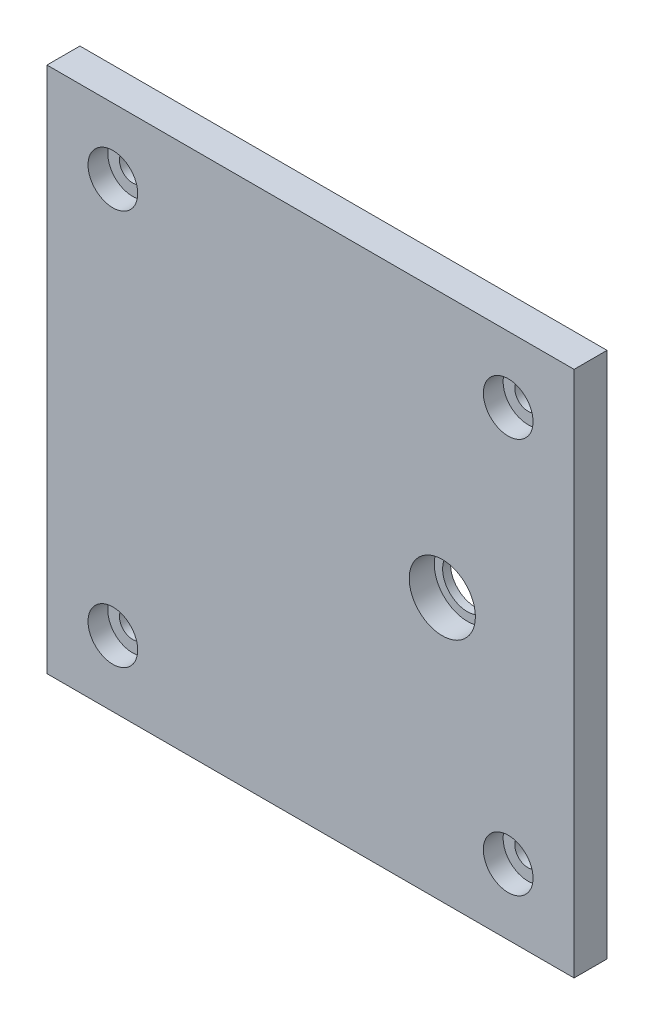
ISO-10303-21;
HEADER;
FILE_DESCRIPTION(('STEP AP214'),'2;1');
FILE_NAME('part.step','',(''),(''),'','','');
FILE_SCHEMA(('AUTOMOTIVE_DESIGN { 1 0 10303 214 1 1 1 1 }'));
ENDSEC;
DATA;
#1=APPLICATION_CONTEXT('core data for automotive mechanical design processes');
#2=APPLICATION_PROTOCOL_DEFINITION('international standard','automotive_design',2000,#1);
#3=PRODUCT_CONTEXT('',#1,'mechanical');
#4=PRODUCT('Part','Part','',(#3));
#5=PRODUCT_RELATED_PRODUCT_CATEGORY('part','',(#4));
#6=PRODUCT_DEFINITION_FORMATION('','',#4);
#7=PRODUCT_DEFINITION_CONTEXT('part definition',#1,'design');
#8=PRODUCT_DEFINITION('design','',#6,#7);
#9=PRODUCT_DEFINITION_SHAPE('','',#8);
#10=(LENGTH_UNIT() NAMED_UNIT(*) SI_UNIT(.MILLI.,.METRE.));
#11=(NAMED_UNIT(*) PLANE_ANGLE_UNIT() SI_UNIT($,.RADIAN.));
#12=(NAMED_UNIT(*) SI_UNIT($,.STERADIAN.) SOLID_ANGLE_UNIT());
#13=UNCERTAINTY_MEASURE_WITH_UNIT(LENGTH_MEASURE(1.E-05),#10,'distance_accuracy_value','');
#14=(GEOMETRIC_REPRESENTATION_CONTEXT(3) GLOBAL_UNCERTAINTY_ASSIGNED_CONTEXT((#13)) GLOBAL_UNIT_ASSIGNED_CONTEXT((#10,
#11,#12)) REPRESENTATION_CONTEXT('',''));
#15=CARTESIAN_POINT('',(0.,0.,0.));
#16=DIRECTION('',(0.,0.,1.));
#17=DIRECTION('',(1.,0.,0.));
#18=AXIS2_PLACEMENT_3D('',#15,#16,#17);
#19=CARTESIAN_POINT('',(-38.1,38.1,6.35));
#20=DIRECTION('',(0.,0.,1.));
#21=DIRECTION('',(1.,0.,0.));
#22=AXIS2_PLACEMENT_3D('',#19,#20,#21);
#23=CYLINDRICAL_SURFACE('',#22,4.7879);
#24=CARTESIAN_POINT('',(-38.1,38.1,2.54));
#25=DIRECTION('',(0.,0.,1.));
#26=DIRECTION('',(1.,0.,0.));
#27=AXIS2_PLACEMENT_3D('',#24,#25,#26);
#28=CIRCLE('',#27,4.7879);
#29=CARTESIAN_POINT('',(-33.3121,38.1,2.54));
#30=VERTEX_POINT('',#29);
#31=EDGE_CURVE('E122',#30,#30,#28,.T.);
#32=ORIENTED_EDGE('',*,*,#31,.F.);
#33=EDGE_LOOP('',(#32));
#34=FACE_BOUND('',#33,.T.);
#35=CARTESIAN_POINT('',(-38.1,38.1,6.35));
#36=DIRECTION('',(0.,0.,1.));
#37=DIRECTION('',(1.,0.,0.));
#38=AXIS2_PLACEMENT_3D('',#35,#36,#37);
#39=CIRCLE('',#38,4.7879);
#40=CARTESIAN_POINT('',(-33.3121,38.1,6.35));
#41=VERTEX_POINT('',#40);
#42=EDGE_CURVE('E131',#41,#41,#39,.F.);
#43=ORIENTED_EDGE('',*,*,#42,.F.);
#44=EDGE_LOOP('',(#43));
#45=FACE_BOUND('',#44,.T.);
#46=ADVANCED_FACE('F16',(#34,#45),#23,.F.);
#47=CARTESIAN_POINT('',(38.1,38.1,6.35));
#48=DIRECTION('',(0.,0.,1.));
#49=DIRECTION('',(1.,0.,0.));
#50=AXIS2_PLACEMENT_3D('',#47,#48,#49);
#51=CYLINDRICAL_SURFACE('',#50,4.7879);
#52=CARTESIAN_POINT('',(38.1,38.1,2.54));
#53=DIRECTION('',(0.,0.,1.));
#54=DIRECTION('',(1.,0.,0.));
#55=AXIS2_PLACEMENT_3D('',#52,#53,#54);
#56=CIRCLE('',#55,4.7879);
#57=CARTESIAN_POINT('',(42.8879,38.1,2.54));
#58=VERTEX_POINT('',#57);
#59=EDGE_CURVE('E119',#58,#58,#56,.T.);
#60=ORIENTED_EDGE('',*,*,#59,.F.);
#61=EDGE_LOOP('',(#60));
#62=FACE_BOUND('',#61,.T.);
#63=CARTESIAN_POINT('',(38.1,38.1,6.35));
#64=DIRECTION('',(0.,0.,1.));
#65=DIRECTION('',(1.,0.,0.));
#66=AXIS2_PLACEMENT_3D('',#63,#64,#65);
#67=CIRCLE('',#66,4.7879);
#68=CARTESIAN_POINT('',(42.8879,38.1,6.35));
#69=VERTEX_POINT('',#68);
#70=EDGE_CURVE('E128',#69,#69,#67,.F.);
#71=ORIENTED_EDGE('',*,*,#70,.F.);
#72=EDGE_LOOP('',(#71));
#73=FACE_BOUND('',#72,.T.);
#74=ADVANCED_FACE('F223',(#62,#73),#51,.F.);
#75=CARTESIAN_POINT('',(38.1,-38.1,6.35));
#76=DIRECTION('',(0.,0.,1.));
#77=DIRECTION('',(1.,0.,0.));
#78=AXIS2_PLACEMENT_3D('',#75,#76,#77);
#79=CYLINDRICAL_SURFACE('',#78,4.7879);
#80=CARTESIAN_POINT('',(38.1,-38.1,2.54));
#81=DIRECTION('',(0.,0.,1.));
#82=DIRECTION('',(1.,0.,0.));
#83=AXIS2_PLACEMENT_3D('',#80,#81,#82);
#84=CIRCLE('',#83,4.7879);
#85=CARTESIAN_POINT('',(42.8879,-38.1,2.54));
#86=VERTEX_POINT('',#85);
#87=EDGE_CURVE('E116',#86,#86,#84,.T.);
#88=ORIENTED_EDGE('',*,*,#87,.F.);
#89=EDGE_LOOP('',(#88));
#90=FACE_BOUND('',#89,.T.);
#91=CARTESIAN_POINT('',(38.1,-38.1,6.35));
#92=DIRECTION('',(0.,0.,1.));
#93=DIRECTION('',(1.,0.,0.));
#94=AXIS2_PLACEMENT_3D('',#91,#92,#93);
#95=CIRCLE('',#94,4.7879);
#96=CARTESIAN_POINT('',(42.8879,-38.1,6.35));
#97=VERTEX_POINT('',#96);
#98=EDGE_CURVE('E125',#97,#97,#95,.F.);
#99=ORIENTED_EDGE('',*,*,#98,.F.);
#100=EDGE_LOOP('',(#99));
#101=FACE_BOUND('',#100,.T.);
#102=ADVANCED_FACE('F154',(#90,#101),#79,.F.);
#103=CARTESIAN_POINT('',(-38.1,-38.1,6.35));
#104=DIRECTION('',(0.,0.,1.));
#105=DIRECTION('',(1.,0.,0.));
#106=AXIS2_PLACEMENT_3D('',#103,#104,#105);
#107=CYLINDRICAL_SURFACE('',#106,4.7879);
#108=CARTESIAN_POINT('',(-38.1,-38.1,2.54));
#109=DIRECTION('',(0.,0.,1.));
#110=DIRECTION('',(1.,0.,0.));
#111=AXIS2_PLACEMENT_3D('',#108,#109,#110);
#112=CIRCLE('',#111,4.7879);
#113=CARTESIAN_POINT('',(-33.3121,-38.1,2.54));
#114=VERTEX_POINT('',#113);
#115=EDGE_CURVE('E113',#114,#114,#112,.T.);
#116=ORIENTED_EDGE('',*,*,#115,.F.);
#117=EDGE_LOOP('',(#116));
#118=FACE_BOUND('',#117,.T.);
#119=CARTESIAN_POINT('',(-38.1,-38.1,6.35));
#120=DIRECTION('',(0.,0.,1.));
#121=DIRECTION('',(1.,0.,0.));
#122=AXIS2_PLACEMENT_3D('',#119,#120,#121);
#123=CIRCLE('',#122,4.7879);
#124=CARTESIAN_POINT('',(-33.3121,-38.1,6.35));
#125=VERTEX_POINT('',#124);
#126=EDGE_CURVE('E133',#125,#125,#123,.F.);
#127=ORIENTED_EDGE('',*,*,#126,.F.);
#128=EDGE_LOOP('',(#127));
#129=FACE_BOUND('',#128,.T.);
#130=ADVANCED_FACE('F143',(#118,#129),#107,.F.);
#131=CARTESIAN_POINT('',(25.4,0.,6.35));
#132=DIRECTION('',(0.,0.,1.));
#133=DIRECTION('',(1.,0.,0.));
#134=AXIS2_PLACEMENT_3D('',#131,#132,#133);
#135=CYLINDRICAL_SURFACE('',#134,6.3754);
#136=CARTESIAN_POINT('',(25.4,0.,1.524));
#137=DIRECTION('',(0.,0.,1.));
#138=DIRECTION('',(1.,0.,0.));
#139=AXIS2_PLACEMENT_3D('',#136,#137,#138);
#140=CIRCLE('',#139,6.3754);
#141=CARTESIAN_POINT('',(31.7754,0.,1.524));
#142=VERTEX_POINT('',#141);
#143=EDGE_CURVE('E75',#142,#142,#140,.T.);
#144=ORIENTED_EDGE('',*,*,#143,.F.);
#145=EDGE_LOOP('',(#144));
#146=FACE_BOUND('',#145,.T.);
#147=CARTESIAN_POINT('',(25.4,0.,6.35));
#148=DIRECTION('',(0.,0.,1.));
#149=DIRECTION('',(1.,0.,0.));
#150=AXIS2_PLACEMENT_3D('',#147,#148,#149);
#151=CIRCLE('',#150,6.3754);
#152=CARTESIAN_POINT('',(31.7754,0.,6.35));
#153=VERTEX_POINT('',#152);
#154=EDGE_CURVE('E19',#153,#153,#151,.F.);
#155=ORIENTED_EDGE('',*,*,#154,.F.);
#156=EDGE_LOOP('',(#155));
#157=FACE_BOUND('',#156,.T.);
#158=ADVANCED_FACE('F141',(#146,#157),#135,.F.);
#159=CARTESIAN_POINT('',(0.,0.,6.35));
#160=DIRECTION('',(0.,0.,1.));
#161=DIRECTION('',(1.,0.,0.));
#162=AXIS2_PLACEMENT_3D('',#159,#160,#161);
#163=PLANE('',#162);
#164=ORIENTED_EDGE('',*,*,#98,.T.);
#165=EDGE_LOOP('',(#164));
#166=FACE_BOUND('',#165,.T.);
#167=ORIENTED_EDGE('',*,*,#70,.T.);
#168=EDGE_LOOP('',(#167));
#169=FACE_BOUND('',#168,.T.);
#170=ORIENTED_EDGE('',*,*,#42,.T.);
#171=EDGE_LOOP('',(#170));
#172=FACE_BOUND('',#171,.T.);
#173=ORIENTED_EDGE('',*,*,#126,.T.);
#174=EDGE_LOOP('',(#173));
#175=FACE_BOUND('',#174,.T.);
#176=ORIENTED_EDGE('',*,*,#154,.T.);
#177=EDGE_LOOP('',(#176));
#178=FACE_BOUND('',#177,.T.);
#179=DIRECTION('',(1.,0.,0.));
#180=VECTOR('',#179,1.);
#181=CARTESIAN_POINT('',(50.8,50.8,6.35));
#182=LINE('',#181,#180);
#183=CARTESIAN_POINT('',(-50.8,50.8,6.35));
#184=VERTEX_POINT('',#183);
#185=CARTESIAN_POINT('',(50.8,50.8,6.35));
#186=VERTEX_POINT('',#185);
#187=EDGE_CURVE('E71',#184,#186,#182,.T.);
#188=ORIENTED_EDGE('',*,*,#187,.F.);
#189=DIRECTION('',(0.,1.,0.));
#190=VECTOR('',#189,1.);
#191=CARTESIAN_POINT('',(-50.8,50.8,6.35));
#192=LINE('',#191,#190);
#193=CARTESIAN_POINT('',(-50.8,-50.8,6.35));
#194=VERTEX_POINT('',#193);
#195=EDGE_CURVE('E67',#194,#184,#192,.T.);
#196=ORIENTED_EDGE('',*,*,#195,.F.);
#197=DIRECTION('',(1.,0.,0.));
#198=VECTOR('',#197,1.);
#199=CARTESIAN_POINT('',(-50.8,-50.8,6.35));
#200=LINE('',#199,#198);
#201=CARTESIAN_POINT('',(50.8,-50.8,6.35));
#202=VERTEX_POINT('',#201);
#203=EDGE_CURVE('E58',#202,#194,#200,.F.);
#204=ORIENTED_EDGE('',*,*,#203,.F.);
#205=DIRECTION('',(0.,1.,0.));
#206=VECTOR('',#205,1.);
#207=CARTESIAN_POINT('',(50.8,-50.8,6.35));
#208=LINE('',#207,#206);
#209=EDGE_CURVE('E53',#186,#202,#208,.F.);
#210=ORIENTED_EDGE('',*,*,#209,.F.);
#211=EDGE_LOOP('',(#188,#196,#204,#210));
#212=FACE_BOUND('',#211,.T.);
#213=ADVANCED_FACE('F70',(#166,#169,#172,#175,#178,#212),#163,.T.);
#214=CARTESIAN_POINT('',(0.,0.,2.54));
#215=DIRECTION('',(0.,0.,1.));
#216=DIRECTION('',(1.,0.,0.));
#217=AXIS2_PLACEMENT_3D('',#214,#215,#216);
#218=PLANE('',#217);
#219=CARTESIAN_POINT('',(-38.1,38.1,2.54));
#220=DIRECTION('',(0.,0.,1.));
#221=DIRECTION('',(1.,0.,0.));
#222=AXIS2_PLACEMENT_3D('',#219,#220,#221);
#223=CIRCLE('',#222,2.54);
#224=CARTESIAN_POINT('',(-35.56,38.1,2.54));
#225=VERTEX_POINT('',#224);
#226=EDGE_CURVE('E108',#225,#225,#223,.F.);
#227=ORIENTED_EDGE('',*,*,#226,.T.);
#228=EDGE_LOOP('',(#227));
#229=FACE_BOUND('',#228,.T.);
#230=ORIENTED_EDGE('',*,*,#31,.T.);
#231=EDGE_LOOP('',(#230));
#232=FACE_BOUND('',#231,.T.);
#233=ADVANCED_FACE('F151',(#229,#232),#218,.T.);
#234=CARTESIAN_POINT('',(0.,0.,2.54));
#235=DIRECTION('',(0.,0.,1.));
#236=DIRECTION('',(1.,0.,0.));
#237=AXIS2_PLACEMENT_3D('',#234,#235,#236);
#238=PLANE('',#237);
#239=CARTESIAN_POINT('',(38.1,38.1,2.54));
#240=DIRECTION('',(0.,0.,1.));
#241=DIRECTION('',(1.,0.,0.));
#242=AXIS2_PLACEMENT_3D('',#239,#240,#241);
#243=CIRCLE('',#242,2.54);
#244=CARTESIAN_POINT('',(40.64,38.1,2.54));
#245=VERTEX_POINT('',#244);
#246=EDGE_CURVE('E105',#245,#245,#243,.F.);
#247=ORIENTED_EDGE('',*,*,#246,.T.);
#248=EDGE_LOOP('',(#247));
#249=FACE_BOUND('',#248,.T.);
#250=ORIENTED_EDGE('',*,*,#59,.T.);
#251=EDGE_LOOP('',(#250));
#252=FACE_BOUND('',#251,.T.);
#253=ADVANCED_FACE('F208',(#249,#252),#238,.T.);
#254=CARTESIAN_POINT('',(0.,0.,2.54));
#255=DIRECTION('',(0.,0.,1.));
#256=DIRECTION('',(1.,0.,0.));
#257=AXIS2_PLACEMENT_3D('',#254,#255,#256);
#258=PLANE('',#257);
#259=CARTESIAN_POINT('',(38.1,-38.1,2.54));
#260=DIRECTION('',(0.,0.,1.));
#261=DIRECTION('',(1.,0.,0.));
#262=AXIS2_PLACEMENT_3D('',#259,#260,#261);
#263=CIRCLE('',#262,2.54);
#264=CARTESIAN_POINT('',(40.64,-38.1,2.54));
#265=VERTEX_POINT('',#264);
#266=EDGE_CURVE('E102',#265,#265,#263,.F.);
#267=ORIENTED_EDGE('',*,*,#266,.T.);
#268=EDGE_LOOP('',(#267));
#269=FACE_BOUND('',#268,.T.);
#270=ORIENTED_EDGE('',*,*,#87,.T.);
#271=EDGE_LOOP('',(#270));
#272=FACE_BOUND('',#271,.T.);
#273=ADVANCED_FACE('F204',(#269,#272),#258,.T.);
#274=CARTESIAN_POINT('',(0.,0.,2.54));
#275=DIRECTION('',(0.,0.,1.));
#276=DIRECTION('',(1.,0.,0.));
#277=AXIS2_PLACEMENT_3D('',#274,#275,#276);
#278=PLANE('',#277);
#279=CARTESIAN_POINT('',(-38.1,-38.1,2.54));
#280=DIRECTION('',(0.,0.,1.));
#281=DIRECTION('',(1.,0.,0.));
#282=AXIS2_PLACEMENT_3D('',#279,#280,#281);
#283=CIRCLE('',#282,2.54);
#284=CARTESIAN_POINT('',(-35.56,-38.1,2.54));
#285=VERTEX_POINT('',#284);
#286=EDGE_CURVE('E99',#285,#285,#283,.F.);
#287=ORIENTED_EDGE('',*,*,#286,.T.);
#288=EDGE_LOOP('',(#287));
#289=FACE_BOUND('',#288,.T.);
#290=ORIENTED_EDGE('',*,*,#115,.T.);
#291=EDGE_LOOP('',(#290));
#292=FACE_BOUND('',#291,.T.);
#293=ADVANCED_FACE('F200',(#289,#292),#278,.T.);
#294=CARTESIAN_POINT('',(0.,0.,1.524));
#295=DIRECTION('',(0.,0.,1.));
#296=DIRECTION('',(1.,0.,0.));
#297=AXIS2_PLACEMENT_3D('',#294,#295,#296);
#298=PLANE('',#297);
#299=CARTESIAN_POINT('',(25.4,0.,1.524));
#300=DIRECTION('',(0.,0.,1.));
#301=DIRECTION('',(1.,0.,0.));
#302=AXIS2_PLACEMENT_3D('',#299,#300,#301);
#303=CIRCLE('',#302,4.7625);
#304=CARTESIAN_POINT('',(30.1625,0.,1.524));
#305=VERTEX_POINT('',#304);
#306=EDGE_CURVE('E96',#305,#305,#303,.F.);
#307=ORIENTED_EDGE('',*,*,#306,.T.);
#308=EDGE_LOOP('',(#307));
#309=FACE_BOUND('',#308,.T.);
#310=ORIENTED_EDGE('',*,*,#143,.T.);
#311=EDGE_LOOP('',(#310));
#312=FACE_BOUND('',#311,.T.);
#313=ADVANCED_FACE('F197',(#309,#312),#298,.T.);
#314=CARTESIAN_POINT('',(-50.8,50.8,0.));
#315=DIRECTION('',(-1.,0.,0.));
#316=DIRECTION('',(0.,0.,1.));
#317=AXIS2_PLACEMENT_3D('',#314,#315,#316);
#318=PLANE('',#317);
#319=DIRECTION('',(0.,0.,1.));
#320=VECTOR('',#319,1.);
#321=CARTESIAN_POINT('',(-50.8,50.8,0.));
#322=LINE('',#321,#320);
#323=CARTESIAN_POINT('',(-50.8,50.8,0.));
#324=VERTEX_POINT('',#323);
#325=EDGE_CURVE('E383',#324,#184,#322,.T.);
#326=ORIENTED_EDGE('',*,*,#325,.F.);
#327=DIRECTION('',(0.,1.,0.));
#328=VECTOR('',#327,1.);
#329=CARTESIAN_POINT('',(-50.8,0.,0.));
#330=LINE('',#329,#328);
#331=CARTESIAN_POINT('',(-50.8,-50.8,0.));
#332=VERTEX_POINT('',#331);
#333=EDGE_CURVE('E79',#324,#332,#330,.F.);
#334=ORIENTED_EDGE('',*,*,#333,.T.);
#335=DIRECTION('',(0.,0.,-1.));
#336=VECTOR('',#335,1.);
#337=CARTESIAN_POINT('',(-50.8,-50.8,0.));
#338=LINE('',#337,#336);
#339=EDGE_CURVE('E63',#194,#332,#338,.T.);
#340=ORIENTED_EDGE('',*,*,#339,.F.);
#341=ORIENTED_EDGE('',*,*,#195,.T.);
#342=EDGE_LOOP('',(#326,#334,#340,#341));
#343=FACE_BOUND('',#342,.T.);
#344=ADVANCED_FACE('F78',(#343),#318,.T.);
#345=CARTESIAN_POINT('',(-50.8,-50.8,0.));
#346=DIRECTION('',(0.,-1.,0.));
#347=DIRECTION('',(0.,0.,-1.));
#348=AXIS2_PLACEMENT_3D('',#345,#346,#347);
#349=PLANE('',#348);
#350=ORIENTED_EDGE('',*,*,#339,.T.);
#351=DIRECTION('',(1.,0.,0.));
#352=VECTOR('',#351,1.);
#353=CARTESIAN_POINT('',(0.,-50.8,0.));
#354=LINE('',#353,#352);
#355=CARTESIAN_POINT('',(50.8,-50.8,0.));
#356=VERTEX_POINT('',#355);
#357=EDGE_CURVE('E385',#332,#356,#354,.T.);
#358=ORIENTED_EDGE('',*,*,#357,.T.);
#359=DIRECTION('',(0.,0.,-1.));
#360=VECTOR('',#359,1.);
#361=CARTESIAN_POINT('',(50.8,-50.8,0.));
#362=LINE('',#361,#360);
#363=EDGE_CURVE('E65',#202,#356,#362,.T.);
#364=ORIENTED_EDGE('',*,*,#363,.F.);
#365=ORIENTED_EDGE('',*,*,#203,.T.);
#366=EDGE_LOOP('',(#350,#358,#364,#365));
#367=FACE_BOUND('',#366,.T.);
#368=ADVANCED_FACE('F60',(#367),#349,.T.);
#369=CARTESIAN_POINT('',(50.8,-50.8,0.));
#370=DIRECTION('',(1.,0.,0.));
#371=DIRECTION('',(0.,0.,-1.));
#372=AXIS2_PLACEMENT_3D('',#369,#370,#371);
#373=PLANE('',#372);
#374=ORIENTED_EDGE('',*,*,#363,.T.);
#375=DIRECTION('',(0.,1.,0.));
#376=VECTOR('',#375,1.);
#377=CARTESIAN_POINT('',(50.8,0.,0.));
#378=LINE('',#377,#376);
#379=CARTESIAN_POINT('',(50.8,50.8,0.));
#380=VERTEX_POINT('',#379);
#381=EDGE_CURVE('E382',#356,#380,#378,.T.);
#382=ORIENTED_EDGE('',*,*,#381,.T.);
#383=DIRECTION('',(0.,0.,1.));
#384=VECTOR('',#383,1.);
#385=CARTESIAN_POINT('',(50.8,50.8,0.));
#386=LINE('',#385,#384);
#387=EDGE_CURVE('E34',#186,#380,#386,.F.);
#388=ORIENTED_EDGE('',*,*,#387,.F.);
#389=ORIENTED_EDGE('',*,*,#209,.T.);
#390=EDGE_LOOP('',(#374,#382,#388,#389));
#391=FACE_BOUND('',#390,.T.);
#392=ADVANCED_FACE('F190',(#391),#373,.T.);
#393=CARTESIAN_POINT('',(50.8,50.8,0.));
#394=DIRECTION('',(0.,1.,0.));
#395=DIRECTION('',(0.,0.,1.));
#396=AXIS2_PLACEMENT_3D('',#393,#394,#395);
#397=PLANE('',#396);
#398=ORIENTED_EDGE('',*,*,#387,.T.);
#399=DIRECTION('',(1.,0.,0.));
#400=VECTOR('',#399,1.);
#401=CARTESIAN_POINT('',(0.,50.8,0.));
#402=LINE('',#401,#400);
#403=EDGE_CURVE('E95',#380,#324,#402,.F.);
#404=ORIENTED_EDGE('',*,*,#403,.T.);
#405=ORIENTED_EDGE('',*,*,#325,.T.);
#406=ORIENTED_EDGE('',*,*,#187,.T.);
#407=EDGE_LOOP('',(#398,#404,#405,#406));
#408=FACE_BOUND('',#407,.T.);
#409=ADVANCED_FACE('F186',(#408),#397,.T.);
#410=CARTESIAN_POINT('',(-38.1,38.1,6.35));
#411=DIRECTION('',(0.,0.,1.));
#412=DIRECTION('',(1.,0.,0.));
#413=AXIS2_PLACEMENT_3D('',#410,#411,#412);
#414=CYLINDRICAL_SURFACE('',#413,2.54);
#415=CARTESIAN_POINT('',(-38.1,38.1,0.));
#416=DIRECTION('',(0.,0.,1.));
#417=DIRECTION('',(1.,0.,0.));
#418=AXIS2_PLACEMENT_3D('',#415,#416,#417);
#419=CIRCLE('',#418,2.54);
#420=CARTESIAN_POINT('',(-35.56,38.1,0.));
#421=VERTEX_POINT('',#420);
#422=EDGE_CURVE('E92',#421,#421,#419,.F.);
#423=ORIENTED_EDGE('',*,*,#422,.T.);
#424=EDGE_LOOP('',(#423));
#425=FACE_BOUND('',#424,.T.);
#426=ORIENTED_EDGE('',*,*,#226,.F.);
#427=EDGE_LOOP('',(#426));
#428=FACE_BOUND('',#427,.T.);
#429=ADVANCED_FACE('F182',(#425,#428),#414,.F.);
#430=CARTESIAN_POINT('',(38.1,38.1,6.35));
#431=DIRECTION('',(0.,0.,1.));
#432=DIRECTION('',(1.,0.,0.));
#433=AXIS2_PLACEMENT_3D('',#430,#431,#432);
#434=CYLINDRICAL_SURFACE('',#433,2.54);
#435=CARTESIAN_POINT('',(38.1,38.1,0.));
#436=DIRECTION('',(0.,0.,1.));
#437=DIRECTION('',(1.,0.,0.));
#438=AXIS2_PLACEMENT_3D('',#435,#436,#437);
#439=CIRCLE('',#438,2.54);
#440=CARTESIAN_POINT('',(40.64,38.1,0.));
#441=VERTEX_POINT('',#440);
#442=EDGE_CURVE('E89',#441,#441,#439,.F.);
#443=ORIENTED_EDGE('',*,*,#442,.T.);
#444=EDGE_LOOP('',(#443));
#445=FACE_BOUND('',#444,.T.);
#446=ORIENTED_EDGE('',*,*,#246,.F.);
#447=EDGE_LOOP('',(#446));
#448=FACE_BOUND('',#447,.T.);
#449=ADVANCED_FACE('F178',(#445,#448),#434,.F.);
#450=CARTESIAN_POINT('',(38.1,-38.1,6.35));
#451=DIRECTION('',(0.,0.,1.));
#452=DIRECTION('',(1.,0.,0.));
#453=AXIS2_PLACEMENT_3D('',#450,#451,#452);
#454=CYLINDRICAL_SURFACE('',#453,2.54);
#455=CARTESIAN_POINT('',(38.1,-38.1,0.));
#456=DIRECTION('',(0.,0.,1.));
#457=DIRECTION('',(1.,0.,0.));
#458=AXIS2_PLACEMENT_3D('',#455,#456,#457);
#459=CIRCLE('',#458,2.54);
#460=CARTESIAN_POINT('',(40.64,-38.1,0.));
#461=VERTEX_POINT('',#460);
#462=EDGE_CURVE('E86',#461,#461,#459,.F.);
#463=ORIENTED_EDGE('',*,*,#462,.T.);
#464=EDGE_LOOP('',(#463));
#465=FACE_BOUND('',#464,.T.);
#466=ORIENTED_EDGE('',*,*,#266,.F.);
#467=EDGE_LOOP('',(#466));
#468=FACE_BOUND('',#467,.T.);
#469=ADVANCED_FACE('F174',(#465,#468),#454,.F.);
#470=CARTESIAN_POINT('',(-38.1,-38.1,6.35));
#471=DIRECTION('',(0.,0.,1.));
#472=DIRECTION('',(1.,0.,0.));
#473=AXIS2_PLACEMENT_3D('',#470,#471,#472);
#474=CYLINDRICAL_SURFACE('',#473,2.54);
#475=CARTESIAN_POINT('',(-38.1,-38.1,0.));
#476=DIRECTION('',(0.,0.,1.));
#477=DIRECTION('',(1.,0.,0.));
#478=AXIS2_PLACEMENT_3D('',#475,#476,#477);
#479=CIRCLE('',#478,2.54);
#480=CARTESIAN_POINT('',(-35.56,-38.1,0.));
#481=VERTEX_POINT('',#480);
#482=EDGE_CURVE('E25',#481,#481,#479,.F.);
#483=ORIENTED_EDGE('',*,*,#482,.T.);
#484=EDGE_LOOP('',(#483));
#485=FACE_BOUND('',#484,.T.);
#486=ORIENTED_EDGE('',*,*,#286,.F.);
#487=EDGE_LOOP('',(#486));
#488=FACE_BOUND('',#487,.T.);
#489=ADVANCED_FACE('F166',(#485,#488),#474,.F.);
#490=CARTESIAN_POINT('',(25.4,0.,6.35));
#491=DIRECTION('',(0.,0.,1.));
#492=DIRECTION('',(1.,0.,0.));
#493=AXIS2_PLACEMENT_3D('',#490,#491,#492);
#494=CYLINDRICAL_SURFACE('',#493,4.7625);
#495=ORIENTED_EDGE('',*,*,#306,.F.);
#496=EDGE_LOOP('',(#495));
#497=FACE_BOUND('',#496,.T.);
#498=CARTESIAN_POINT('',(25.4,0.,0.));
#499=DIRECTION('',(0.,0.,1.));
#500=DIRECTION('',(1.,0.,0.));
#501=AXIS2_PLACEMENT_3D('',#498,#499,#500);
#502=CIRCLE('',#501,4.7625);
#503=CARTESIAN_POINT('',(30.1625,0.,0.));
#504=VERTEX_POINT('',#503);
#505=EDGE_CURVE('E11',#504,#504,#502,.F.);
#506=ORIENTED_EDGE('',*,*,#505,.T.);
#507=EDGE_LOOP('',(#506));
#508=FACE_BOUND('',#507,.T.);
#509=ADVANCED_FACE('F160',(#497,#508),#494,.F.);
#510=CARTESIAN_POINT('',(0.,0.,0.));
#511=DIRECTION('',(0.,0.,1.));
#512=DIRECTION('',(1.,0.,0.));
#513=AXIS2_PLACEMENT_3D('',#510,#511,#512);
#514=PLANE('',#513);
#515=ORIENTED_EDGE('',*,*,#505,.F.);
#516=EDGE_LOOP('',(#515));
#517=FACE_BOUND('',#516,.T.);
#518=ORIENTED_EDGE('',*,*,#482,.F.);
#519=EDGE_LOOP('',(#518));
#520=FACE_BOUND('',#519,.T.);
#521=ORIENTED_EDGE('',*,*,#462,.F.);
#522=EDGE_LOOP('',(#521));
#523=FACE_BOUND('',#522,.T.);
#524=ORIENTED_EDGE('',*,*,#442,.F.);
#525=EDGE_LOOP('',(#524));
#526=FACE_BOUND('',#525,.T.);
#527=ORIENTED_EDGE('',*,*,#422,.F.);
#528=EDGE_LOOP('',(#527));
#529=FACE_BOUND('',#528,.T.);
#530=ORIENTED_EDGE('',*,*,#381,.F.);
#531=ORIENTED_EDGE('',*,*,#357,.F.);
#532=ORIENTED_EDGE('',*,*,#333,.F.);
#533=ORIENTED_EDGE('',*,*,#403,.F.);
#534=EDGE_LOOP('',(#530,#531,#532,#533));
#535=FACE_BOUND('',#534,.T.);
#536=ADVANCED_FACE('F158',(#517,#520,#523,#526,#529,#535),#514,.F.);
#537=CLOSED_SHELL('',(#46,#74,#102,#130,#158,#213,#233,#253,#273,#293,#313,#344,#368,#392,#409,
#429,#449,#469,#489,#509,#536));
#538=MANIFOLD_SOLID_BREP('B1',#537);
#539=ADVANCED_BREP_SHAPE_REPRESENTATION('',(#18,#538),#14);
#540=SHAPE_DEFINITION_REPRESENTATION(#9,#539);
ENDSEC;
END-ISO-10303-21;
